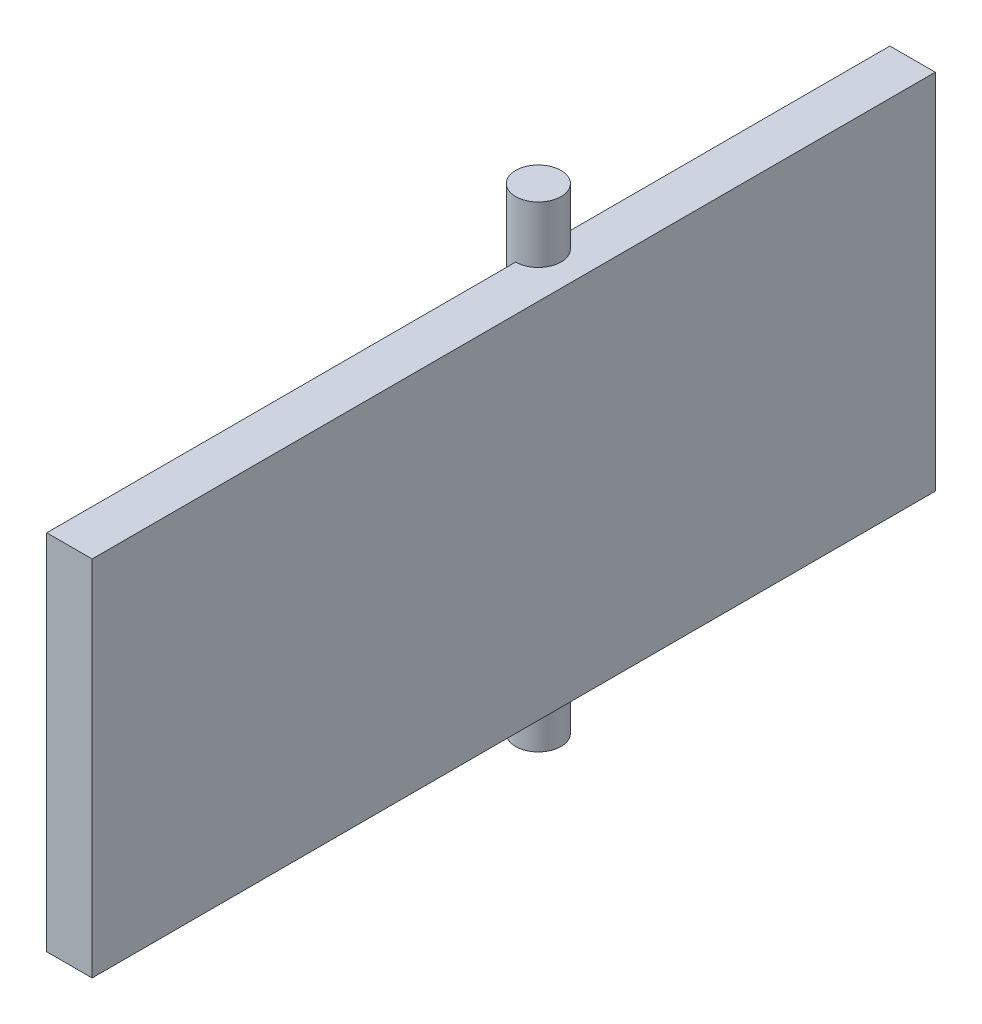
ISO-10303-21;
HEADER;
FILE_DESCRIPTION(('STEP AP214'),'2;1');
FILE_NAME('part.step','',(''),(''),'','','');
FILE_SCHEMA(('AUTOMOTIVE_DESIGN { 1 0 10303 214 1 1 1 1 }'));
ENDSEC;
DATA;
#1=APPLICATION_CONTEXT('core data for automotive mechanical design processes');
#2=APPLICATION_PROTOCOL_DEFINITION('international standard','automotive_design',2000,#1);
#3=PRODUCT_CONTEXT('',#1,'mechanical');
#4=PRODUCT('Part','Part','',(#3));
#5=PRODUCT_RELATED_PRODUCT_CATEGORY('part','',(#4));
#6=PRODUCT_DEFINITION_FORMATION('','',#4);
#7=PRODUCT_DEFINITION_CONTEXT('part definition',#1,'design');
#8=PRODUCT_DEFINITION('design','',#6,#7);
#9=PRODUCT_DEFINITION_SHAPE('','',#8);
#10=(LENGTH_UNIT() NAMED_UNIT(*) SI_UNIT(.MILLI.,.METRE.));
#11=(NAMED_UNIT(*) PLANE_ANGLE_UNIT() SI_UNIT($,.RADIAN.));
#12=(NAMED_UNIT(*) SI_UNIT($,.STERADIAN.) SOLID_ANGLE_UNIT());
#13=UNCERTAINTY_MEASURE_WITH_UNIT(LENGTH_MEASURE(1.E-05),#10,'distance_accuracy_value','');
#14=(GEOMETRIC_REPRESENTATION_CONTEXT(3) GLOBAL_UNCERTAINTY_ASSIGNED_CONTEXT((#13)) GLOBAL_UNIT_ASSIGNED_CONTEXT((#10,
#11,#12)) REPRESENTATION_CONTEXT('',''));
#15=CARTESIAN_POINT('',(0.,0.,0.));
#16=DIRECTION('',(0.,0.,1.));
#17=DIRECTION('',(1.,0.,0.));
#18=AXIS2_PLACEMENT_3D('',#15,#16,#17);
#19=CARTESIAN_POINT('',(14.295,0.,0.));
#20=DIRECTION('',(1.,0.,0.));
#21=DIRECTION('',(0.,0.,-1.));
#22=AXIS2_PLACEMENT_3D('',#19,#20,#21);
#23=PLANE('',#22);
#24=DIRECTION('',(0.,-1.,0.));
#25=VECTOR('',#24,1.);
#26=CARTESIAN_POINT('',(14.295,76.1919670440661,16.5));
#27=LINE('',#26,#25);
#28=CARTESIAN_POINT('',(14.295,70.1919670440661,16.5));
#29=VERTEX_POINT('',#28);
#30=CARTESIAN_POINT('',(14.295,73.6919670440661,16.5));
#31=VERTEX_POINT('',#30);
#32=EDGE_CURVE('E130',#29,#31,#27,.F.);
#33=ORIENTED_EDGE('',*,*,#32,.F.);
#34=DIRECTION('',(0.,0.,1.));
#35=VECTOR('',#34,1.);
#36=CARTESIAN_POINT('',(14.295,70.1919670440661,14.5));
#37=LINE('',#36,#35);
#38=CARTESIAN_POINT('',(14.295,70.1919670440661,14.5));
#39=VERTEX_POINT('',#38);
#40=EDGE_CURVE('E185',#29,#39,#37,.F.);
#41=ORIENTED_EDGE('',*,*,#40,.T.);
#42=DIRECTION('',(0.,-1.,0.));
#43=VECTOR('',#42,1.);
#44=CARTESIAN_POINT('',(14.295,76.1919670440661,14.5));
#45=LINE('',#44,#43);
#46=CARTESIAN_POINT('',(14.295,73.6919670440661,14.5));
#47=VERTEX_POINT('',#46);
#48=EDGE_CURVE('E177',#47,#39,#45,.T.);
#49=ORIENTED_EDGE('',*,*,#48,.F.);
#50=DIRECTION('',(0.,0.,1.));
#51=VECTOR('',#50,1.);
#52=CARTESIAN_POINT('',(14.295,73.6919670440661,37.175));
#53=LINE('',#52,#51);
#54=CARTESIAN_POINT('',(14.295,73.6919670440661,0.));
#55=VERTEX_POINT('',#54);
#56=EDGE_CURVE('E157',#55,#47,#53,.T.);
#57=ORIENTED_EDGE('',*,*,#56,.F.);
#58=DIRECTION('',(0.,1.,0.));
#59=VECTOR('',#58,1.);
#60=CARTESIAN_POINT('',(14.295,73.6919670440661,0.));
#61=LINE('',#60,#59);
#62=CARTESIAN_POINT('',(14.295,57.6919670440661,0.));
#63=VERTEX_POINT('',#62);
#64=EDGE_CURVE('E146',#63,#55,#61,.T.);
#65=ORIENTED_EDGE('',*,*,#64,.F.);
#66=DIRECTION('',(0.,0.,-1.));
#67=VECTOR('',#66,1.);
#68=CARTESIAN_POINT('',(14.295,57.6919670440661,37.175));
#69=LINE('',#68,#67);
#70=CARTESIAN_POINT('',(14.295,57.6919670440661,14.5));
#71=VERTEX_POINT('',#70);
#72=EDGE_CURVE('E147',#71,#63,#69,.T.);
#73=ORIENTED_EDGE('',*,*,#72,.F.);
#74=DIRECTION('',(0.,1.,0.));
#75=VECTOR('',#74,1.);
#76=CARTESIAN_POINT('',(14.295,55.1919670440661,14.5));
#77=LINE('',#76,#75);
#78=CARTESIAN_POINT('',(14.295,61.1919670440661,14.5));
#79=VERTEX_POINT('',#78);
#80=EDGE_CURVE('E124',#71,#79,#77,.T.);
#81=ORIENTED_EDGE('',*,*,#80,.T.);
#82=DIRECTION('',(0.,0.,-1.));
#83=VECTOR('',#82,1.);
#84=CARTESIAN_POINT('',(14.295,61.1919670440661,16.5));
#85=LINE('',#84,#83);
#86=CARTESIAN_POINT('',(14.295,61.1919670440661,16.5));
#87=VERTEX_POINT('',#86);
#88=EDGE_CURVE('E129',#79,#87,#85,.F.);
#89=ORIENTED_EDGE('',*,*,#88,.T.);
#90=DIRECTION('',(0.,1.,0.));
#91=VECTOR('',#90,1.);
#92=CARTESIAN_POINT('',(14.295,55.1919670440661,16.5));
#93=LINE('',#92,#91);
#94=CARTESIAN_POINT('',(14.295,57.6919670440661,16.5));
#95=VERTEX_POINT('',#94);
#96=EDGE_CURVE('E123',#87,#95,#93,.F.);
#97=ORIENTED_EDGE('',*,*,#96,.T.);
#98=CARTESIAN_POINT('',(14.295,57.6919670440661,37.175));
#99=VERTEX_POINT('',#98);
#100=EDGE_CURVE('E135',#99,#95,#69,.T.);
#101=ORIENTED_EDGE('',*,*,#100,.F.);
#102=DIRECTION('',(0.,-1.,0.));
#103=VECTOR('',#102,1.);
#104=CARTESIAN_POINT('',(14.295,73.6919670440661,37.175));
#105=LINE('',#104,#103);
#106=CARTESIAN_POINT('',(14.295,73.6919670440661,37.175));
#107=VERTEX_POINT('',#106);
#108=EDGE_CURVE('E153',#107,#99,#105,.T.);
#109=ORIENTED_EDGE('',*,*,#108,.F.);
#110=EDGE_CURVE('E151',#31,#107,#53,.T.);
#111=ORIENTED_EDGE('',*,*,#110,.F.);
#112=EDGE_LOOP('',(#33,#41,#49,#57,#65,#73,#81,#89,#97,#101,#109,#111));
#113=FACE_BOUND('',#112,.T.);
#114=ADVANCED_FACE('F44',(#113),#23,.F.);
#115=CARTESIAN_POINT('',(16.295,73.6919670440661,37.175));
#116=DIRECTION('',(0.,0.,-1.));
#117=DIRECTION('',(-1.,0.,0.));
#118=AXIS2_PLACEMENT_3D('',#115,#116,#117);
#119=PLANE('',#118);
#120=ORIENTED_EDGE('',*,*,#108,.T.);
#121=DIRECTION('',(-1.,0.,0.));
#122=VECTOR('',#121,1.);
#123=CARTESIAN_POINT('',(16.295,57.6919670440661,37.175));
#124=LINE('',#123,#122);
#125=CARTESIAN_POINT('',(16.295,57.6919670440661,37.175));
#126=VERTEX_POINT('',#125);
#127=EDGE_CURVE('E143',#126,#99,#124,.T.);
#128=ORIENTED_EDGE('',*,*,#127,.F.);
#129=DIRECTION('',(0.,-1.,0.));
#130=VECTOR('',#129,1.);
#131=CARTESIAN_POINT('',(16.295,73.6919670440661,37.175));
#132=LINE('',#131,#130);
#133=CARTESIAN_POINT('',(16.295,73.6919670440661,37.175));
#134=VERTEX_POINT('',#133);
#135=EDGE_CURVE('E161',#134,#126,#132,.T.);
#136=ORIENTED_EDGE('',*,*,#135,.F.);
#137=DIRECTION('',(-1.,0.,0.));
#138=VECTOR('',#137,1.);
#139=CARTESIAN_POINT('',(16.295,73.6919670440661,37.175));
#140=LINE('',#139,#138);
#141=EDGE_CURVE('E162',#134,#107,#140,.T.);
#142=ORIENTED_EDGE('',*,*,#141,.T.);
#143=EDGE_LOOP('',(#120,#128,#136,#142));
#144=FACE_BOUND('',#143,.T.);
#145=ADVANCED_FACE('F211',(#144),#119,.F.);
#146=CARTESIAN_POINT('',(16.295,57.6919670440661,37.175));
#147=DIRECTION('',(0.,1.,0.));
#148=DIRECTION('',(0.,0.,1.));
#149=AXIS2_PLACEMENT_3D('',#146,#147,#148);
#150=PLANE('',#149);
#151=ORIENTED_EDGE('',*,*,#100,.T.);
#152=CARTESIAN_POINT('',(14.295,57.6919670440661,15.5));
#153=DIRECTION('',(0.,1.,0.));
#154=DIRECTION('',(0.,0.,1.));
#155=AXIS2_PLACEMENT_3D('',#152,#153,#154);
#156=CIRCLE('',#155,1.);
#157=EDGE_CURVE('E120',#95,#71,#156,.T.);
#158=ORIENTED_EDGE('',*,*,#157,.T.);
#159=ORIENTED_EDGE('',*,*,#72,.T.);
#160=DIRECTION('',(-1.,0.,0.));
#161=VECTOR('',#160,1.);
#162=CARTESIAN_POINT('',(16.295,57.6919670440661,0.));
#163=LINE('',#162,#161);
#164=CARTESIAN_POINT('',(16.295,57.6919670440661,0.));
#165=VERTEX_POINT('',#164);
#166=EDGE_CURVE('E171',#165,#63,#163,.T.);
#167=ORIENTED_EDGE('',*,*,#166,.F.);
#168=DIRECTION('',(0.,0.,-1.));
#169=VECTOR('',#168,1.);
#170=CARTESIAN_POINT('',(16.295,57.6919670440661,37.175));
#171=LINE('',#170,#169);
#172=EDGE_CURVE('E238',#126,#165,#171,.T.);
#173=ORIENTED_EDGE('',*,*,#172,.F.);
#174=ORIENTED_EDGE('',*,*,#127,.T.);
#175=EDGE_LOOP('',(#151,#158,#159,#167,#173,#174));
#176=FACE_BOUND('',#175,.T.);
#177=ADVANCED_FACE('F141',(#176),#150,.F.);
#178=CARTESIAN_POINT('',(16.295,73.6919670440661,0.));
#179=DIRECTION('',(0.,0.,1.));
#180=DIRECTION('',(1.,0.,0.));
#181=AXIS2_PLACEMENT_3D('',#178,#179,#180);
#182=PLANE('',#181);
#183=ORIENTED_EDGE('',*,*,#64,.T.);
#184=DIRECTION('',(-1.,0.,0.));
#185=VECTOR('',#184,1.);
#186=CARTESIAN_POINT('',(16.295,73.6919670440661,0.));
#187=LINE('',#186,#185);
#188=CARTESIAN_POINT('',(16.295,73.6919670440661,0.));
#189=VERTEX_POINT('',#188);
#190=EDGE_CURVE('E166',#189,#55,#187,.T.);
#191=ORIENTED_EDGE('',*,*,#190,.F.);
#192=DIRECTION('',(0.,1.,0.));
#193=VECTOR('',#192,1.);
#194=CARTESIAN_POINT('',(16.295,73.6919670440661,0.));
#195=LINE('',#194,#193);
#196=EDGE_CURVE('E258',#165,#189,#195,.T.);
#197=ORIENTED_EDGE('',*,*,#196,.F.);
#198=ORIENTED_EDGE('',*,*,#166,.T.);
#199=EDGE_LOOP('',(#183,#191,#197,#198));
#200=FACE_BOUND('',#199,.T.);
#201=ADVANCED_FACE('F218',(#200),#182,.F.);
#202=CARTESIAN_POINT('',(16.295,73.6919670440661,37.175));
#203=DIRECTION('',(0.,-1.,0.));
#204=DIRECTION('',(0.,0.,-1.));
#205=AXIS2_PLACEMENT_3D('',#202,#203,#204);
#206=PLANE('',#205);
#207=CARTESIAN_POINT('',(14.295,73.6919670440661,15.5));
#208=DIRECTION('',(0.,-1.,0.));
#209=DIRECTION('',(0.,0.,-1.));
#210=AXIS2_PLACEMENT_3D('',#207,#208,#209);
#211=CIRCLE('',#210,1.);
#212=EDGE_CURVE('E246',#31,#47,#211,.F.);
#213=ORIENTED_EDGE('',*,*,#212,.F.);
#214=ORIENTED_EDGE('',*,*,#110,.T.);
#215=ORIENTED_EDGE('',*,*,#141,.F.);
#216=DIRECTION('',(0.,0.,1.));
#217=VECTOR('',#216,1.);
#218=CARTESIAN_POINT('',(16.295,73.6919670440661,37.175));
#219=LINE('',#218,#217);
#220=EDGE_CURVE('E167',#189,#134,#219,.T.);
#221=ORIENTED_EDGE('',*,*,#220,.F.);
#222=ORIENTED_EDGE('',*,*,#190,.T.);
#223=ORIENTED_EDGE('',*,*,#56,.T.);
#224=EDGE_LOOP('',(#213,#214,#215,#221,#222,#223));
#225=FACE_BOUND('',#224,.T.);
#226=ADVANCED_FACE('F221',(#225),#206,.F.);
#227=CARTESIAN_POINT('',(16.295,0.,0.));
#228=DIRECTION('',(1.,0.,0.));
#229=DIRECTION('',(0.,0.,-1.));
#230=AXIS2_PLACEMENT_3D('',#227,#228,#229);
#231=PLANE('',#230);
#232=ORIENTED_EDGE('',*,*,#135,.T.);
#233=ORIENTED_EDGE('',*,*,#172,.T.);
#234=ORIENTED_EDGE('',*,*,#196,.T.);
#235=ORIENTED_EDGE('',*,*,#220,.T.);
#236=EDGE_LOOP('',(#232,#233,#234,#235));
#237=FACE_BOUND('',#236,.T.);
#238=ADVANCED_FACE('F225',(#237),#231,.T.);
#239=CARTESIAN_POINT('',(14.295,76.1919670440661,15.5));
#240=DIRECTION('',(0.,-1.,0.));
#241=DIRECTION('',(0.,0.,-1.));
#242=AXIS2_PLACEMENT_3D('',#239,#240,#241);
#243=CYLINDRICAL_SURFACE('',#242,1.);
#244=CARTESIAN_POINT('',(14.295,76.1919670440661,15.5));
#245=DIRECTION('',(0.,1.,0.));
#246=DIRECTION('',(0.,0.,1.));
#247=AXIS2_PLACEMENT_3D('',#244,#245,#246);
#248=CIRCLE('',#247,1.);
#249=CARTESIAN_POINT('',(14.295,76.1919670440661,16.5));
#250=VERTEX_POINT('',#249);
#251=EDGE_CURVE('E249',#250,#250,#248,.T.);
#252=ORIENTED_EDGE('',*,*,#251,.F.);
#253=EDGE_LOOP('',(#252));
#254=FACE_BOUND('',#253,.T.);
#255=ORIENTED_EDGE('',*,*,#48,.T.);
#256=CARTESIAN_POINT('',(14.295,70.1919670440661,14.5));
#257=CARTESIAN_POINT('',(14.2950025550744,70.2198052367879,14.5000084726861));
#258=CARTESIAN_POINT('',(14.2938375494361,70.2476421271243,14.50000021537));
#259=CARTESIAN_POINT('',(14.289192246194,70.3031219155914,14.5000119302077));
#260=CARTESIAN_POINT('',(14.285711962686,70.3307648149021,14.5000319021896));
#261=CARTESIAN_POINT('',(14.2764477931608,70.3857138560473,14.500161877896));
#262=CARTESIAN_POINT('',(14.2706598664325,70.4130193201017,14.5002720399026));
#263=CARTESIAN_POINT('',(14.2568275144874,70.4670424217103,14.5007051556566));
#264=CARTESIAN_POINT('',(14.2487831184668,70.4937600668655,14.5010281066508));
#265=CARTESIAN_POINT('',(14.2213194545419,70.5728056447075,14.5025463105821));
#266=CARTESIAN_POINT('',(14.1985713868733,70.6240163288335,14.5042909948775));
#267=CARTESIAN_POINT('',(14.1449735909556,70.7217285583307,14.5109521102541));
#268=CARTESIAN_POINT('',(14.1141312905753,70.7682343673108,14.5158656393623));
#269=CARTESIAN_POINT('',(14.0469576585634,70.8533121438701,14.5306663007788));
#270=CARTESIAN_POINT('',(14.0108875781512,70.8921229419679,14.5403518073493));
#271=CARTESIAN_POINT('',(13.9344302429271,70.9625638896558,14.5664010018036));
#272=CARTESIAN_POINT('',(13.8940497043936,70.9942049771538,14.582754409152));
#273=CARTESIAN_POINT('',(13.8174063482864,71.0457421899686,14.6205265775903));
#274=CARTESIAN_POINT('',(13.7813313353144,71.0666508236321,14.6409526814356));
#275=CARTESIAN_POINT('',(13.7101311104752,71.1026026921886,14.6877558294031));
#276=CARTESIAN_POINT('',(13.675005939995,71.1176456718827,14.7141331323671));
#277=CARTESIAN_POINT('',(13.6095565808777,71.1418114472942,14.7706641697465));
#278=CARTESIAN_POINT('',(13.5790721788668,71.1512265373317,14.8005109096799));
#279=CARTESIAN_POINT('',(13.521804963194,71.1663581262036,14.8643811864625));
#280=CARTESIAN_POINT('',(13.4950230418303,71.1720737346804,14.8984057264442));
#281=CARTESIAN_POINT('',(13.4435493809667,71.1812520801868,14.9734075698069));
#282=CARTESIAN_POINT('',(13.4193261184073,71.1844361950173,15.0147396942126));
#283=CARTESIAN_POINT('',(13.3770001291804,71.1888267951308,15.1005374802067));
#284=CARTESIAN_POINT('',(13.3589025130841,71.1900316323334,15.145005721042));
#285=CARTESIAN_POINT('',(13.3278546201789,71.1915612722235,15.2404323667974));
#286=CARTESIAN_POINT('',(13.3155537282614,71.1917919782696,15.2916066781811));
#287=CARTESIAN_POINT('',(13.3032331050194,71.1919403658679,15.3692769087492));
#288=CARTESIAN_POINT('',(13.3001480132923,71.1919568686932,15.3953230973099));
#289=CARTESIAN_POINT('',(13.2960317386661,71.1919676724356,15.4475756022013));
#290=CARTESIAN_POINT('',(13.2950004216528,71.1919619748024,15.4737819079639));
#291=CARTESIAN_POINT('',(13.295,71.1919670440661,15.5));
#292=B_SPLINE_CURVE_WITH_KNOTS('',3,(#256,#257,#258,#259,#260,#261,#262,#263,#264,#265,#266,
#267,#268,#269,#270,#271,#272,#273,#274,#275,#276,#277,#278,#279,#280,#281,#282,#283,#284,#285,
#286,#287,#288,#289,#290,#291),.UNSPECIFIED.,.F.,.F.,(4,2,2,2,2,2,2,2,2,2,2,2,2,2,2,2,2,4),(0.,
0.0834878347281844,0.166975161167899,0.250609321497245,0.334242399739234,0.501538275082861,
0.66868116090358,0.829299803909295,0.989671736729554,1.12821123604275,1.26675676216527,
1.39728229603102,1.52783923192527,1.671304684928,1.81488953652531,1.97206569111011,
2.05068136863726,2.12929191228916),.UNSPECIFIED.);
#293=CARTESIAN_POINT('',(13.295,71.1919670440661,15.5));
#294=VERTEX_POINT('',#293);
#295=EDGE_CURVE('E72',#39,#294,#292,.T.);
#296=ORIENTED_EDGE('',*,*,#295,.T.);
#297=CARTESIAN_POINT('',(13.295,71.1919670440661,15.5));
#298=CARTESIAN_POINT('',(13.2949974449256,71.19195857138,15.5278381927218));
#299=CARTESIAN_POINT('',(13.2961624505639,71.1919668286961,15.5556750830582));
#300=CARTESIAN_POINT('',(13.300807753806,71.1919551138584,15.6111548715253));
#301=CARTESIAN_POINT('',(13.3042880373139,71.1919351418765,15.638797770836));
#302=CARTESIAN_POINT('',(13.3135522068392,71.1918051661701,15.6937468119812));
#303=CARTESIAN_POINT('',(13.3193401335675,71.1916950041636,15.7210522760356));
#304=CARTESIAN_POINT('',(13.3331724855126,71.1912618884095,15.7750753776442));
#305=CARTESIAN_POINT('',(13.3412168815333,71.1909389374153,15.8017930227994));
#306=CARTESIAN_POINT('',(13.3686805454581,71.189420733484,15.8808386006414));
#307=CARTESIAN_POINT('',(13.3914286131267,71.1876760491886,15.9320492847674));
#308=CARTESIAN_POINT('',(13.4450264090444,71.181014933812,16.0297615142646));
#309=CARTESIAN_POINT('',(13.4758687094248,71.1761014047039,16.0762673232447));
#310=CARTESIAN_POINT('',(13.5430423414366,71.1613007432873,16.161345099804));
#311=CARTESIAN_POINT('',(13.5791124218488,71.1516152367168,16.2001558979018));
#312=CARTESIAN_POINT('',(13.6555697570729,71.1255660422625,16.2705968455897));
#313=CARTESIAN_POINT('',(13.6959502956064,71.1092126349141,16.3022379330876));
#314=CARTESIAN_POINT('',(13.7725936517136,71.0714404664758,16.3537751459025));
#315=CARTESIAN_POINT('',(13.8086686646856,71.0510143626305,16.374683779566));
#316=CARTESIAN_POINT('',(13.8798688895248,71.004211214663,16.4106356481225));
#317=CARTESIAN_POINT('',(13.914994060005,70.977833911699,16.4256786278166));
#318=CARTESIAN_POINT('',(13.9804434191223,70.9213028743196,16.449844403228));
#319=CARTESIAN_POINT('',(14.0109278211332,70.8914561343862,16.4592594932656));
#320=CARTESIAN_POINT('',(14.068195036806,70.8275858576036,16.4743910821375));
#321=CARTESIAN_POINT('',(14.0949769581697,70.7935613176219,16.4801066906143));
#322=CARTESIAN_POINT('',(14.1464506190333,70.7185594742592,16.4892850361206));
#323=CARTESIAN_POINT('',(14.1706738815927,70.6772273498535,16.4924691509512));
#324=CARTESIAN_POINT('',(14.2129998708196,70.5914295638594,16.4968597510647));
#325=CARTESIAN_POINT('',(14.2310974869159,70.5469613230241,16.4980645882673));
#326=CARTESIAN_POINT('',(14.2621453798211,70.4515346772687,16.4995942281574));
#327=CARTESIAN_POINT('',(14.2744462717386,70.400360365885,16.4998249342035));
#328=CARTESIAN_POINT('',(14.2867668949806,70.3226901353169,16.4999733218018));
#329=CARTESIAN_POINT('',(14.2898519867077,70.2966439467562,16.4999898246271));
#330=CARTESIAN_POINT('',(14.2939682613339,70.2443914418648,16.5000006283695));
#331=CARTESIAN_POINT('',(14.2949995783472,70.2181851361022,16.4999949307363));
#332=CARTESIAN_POINT('',(14.295,70.1919670440661,16.5));
#333=B_SPLINE_CURVE_WITH_KNOTS('',3,(#297,#298,#299,#300,#301,#302,#303,#304,#305,#306,#307,
#308,#309,#310,#311,#312,#313,#314,#315,#316,#317,#318,#319,#320,#321,#322,#323,#324,#325,#326,
#327,#328,#329,#330,#331,#332),.UNSPECIFIED.,.F.,.F.,(4,2,2,2,2,2,2,2,2,2,2,2,2,2,2,2,2,4),(0.,
0.0834878347281738,0.166975161167904,0.250609321497257,0.334242399739243,0.501538275082884,
0.668681160903598,0.829299803909305,0.989671736729571,1.12821123604276,1.26675676216528,
1.39728229603104,1.52783923192529,1.67130468492802,1.81488953652533,1.97206569111013,
2.05068136863728,2.12929191228916),.UNSPECIFIED.);
#334=EDGE_CURVE('E189',#294,#29,#333,.T.);
#335=ORIENTED_EDGE('',*,*,#334,.T.);
#336=ORIENTED_EDGE('',*,*,#32,.T.);
#337=ORIENTED_EDGE('',*,*,#212,.T.);
#338=EDGE_LOOP('',(#255,#296,#335,#336,#337));
#339=FACE_BOUND('',#338,.T.);
#340=ADVANCED_FACE('F201',(#254,#339),#243,.T.);
#341=CARTESIAN_POINT('',(14.295,76.1919670440661,15.5));
#342=DIRECTION('',(0.,1.,0.));
#343=DIRECTION('',(0.,0.,1.));
#344=AXIS2_PLACEMENT_3D('',#341,#342,#343);
#345=PLANE('',#344);
#346=ORIENTED_EDGE('',*,*,#251,.T.);
#347=EDGE_LOOP('',(#346));
#348=FACE_BOUND('',#347,.T.);
#349=ADVANCED_FACE('F234',(#348),#345,.T.);
#350=CARTESIAN_POINT('',(14.295,55.1919670440661,15.5));
#351=DIRECTION('',(0.,1.,0.));
#352=DIRECTION('',(0.,0.,1.));
#353=AXIS2_PLACEMENT_3D('',#350,#351,#352);
#354=CYLINDRICAL_SURFACE('',#353,1.);
#355=CARTESIAN_POINT('',(14.295,55.1919670440661,15.5));
#356=DIRECTION('',(0.,1.,0.));
#357=DIRECTION('',(0.,0.,1.));
#358=AXIS2_PLACEMENT_3D('',#355,#356,#357);
#359=CIRCLE('',#358,1.);
#360=CARTESIAN_POINT('',(14.295,55.1919670440661,16.5));
#361=VERTEX_POINT('',#360);
#362=EDGE_CURVE('E139',#361,#361,#359,.T.);
#363=ORIENTED_EDGE('',*,*,#362,.T.);
#364=EDGE_LOOP('',(#363));
#365=FACE_BOUND('',#364,.T.);
#366=ORIENTED_EDGE('',*,*,#80,.F.);
#367=ORIENTED_EDGE('',*,*,#157,.F.);
#368=ORIENTED_EDGE('',*,*,#96,.F.);
#369=CARTESIAN_POINT('',(14.295,61.1919670440661,16.5));
#370=CARTESIAN_POINT('',(14.2950025550744,61.1641288513443,16.4999915273139));
#371=CARTESIAN_POINT('',(14.2938375494361,61.1362919610079,16.49999978463));
#372=CARTESIAN_POINT('',(14.289192246194,61.0808121725408,16.4999880697923));
#373=CARTESIAN_POINT('',(14.2857119626861,61.0531692732301,16.4999680978104));
#374=CARTESIAN_POINT('',(14.2764477931608,60.9982202320849,16.499838122104));
#375=CARTESIAN_POINT('',(14.2706598664325,60.9709147680306,16.4997279600974));
#376=CARTESIAN_POINT('',(14.2568275144874,60.9168916664219,16.4992948443434));
#377=CARTESIAN_POINT('',(14.2487831184668,60.8901740212667,16.4989718933492));
#378=CARTESIAN_POINT('',(14.2213194545419,60.8111284434247,16.4974536894179));
#379=CARTESIAN_POINT('',(14.1985713868733,60.7599177592987,16.4957090051225));
#380=CARTESIAN_POINT('',(14.1449735909556,60.6622055298015,16.4890478897459));
#381=CARTESIAN_POINT('',(14.1141312905752,60.6156997208215,16.4841343606377));
#382=CARTESIAN_POINT('',(14.0469576585634,60.5306219442621,16.4693336992212));
#383=CARTESIAN_POINT('',(14.0108875781512,60.4918111461644,16.4596481926507));
#384=CARTESIAN_POINT('',(13.9344302429271,60.4213701984764,16.4335989981964));
#385=CARTESIAN_POINT('',(13.8940497043936,60.3897291109785,16.417245590848));
#386=CARTESIAN_POINT('',(13.8174063482864,60.3381918981637,16.3794734224097));
#387=CARTESIAN_POINT('',(13.7813313353144,60.3172832645001,16.3590473185644));
#388=CARTESIAN_POINT('',(13.7101311104752,60.2813313959436,16.3122441705969));
#389=CARTESIAN_POINT('',(13.675005939995,60.2662884162495,16.2858668676329));
#390=CARTESIAN_POINT('',(13.6095565808777,60.2421226408381,16.2293358302535));
#391=CARTESIAN_POINT('',(13.5790721788668,60.2327075508005,16.1994890903201));
#392=CARTESIAN_POINT('',(13.521804963194,60.2175759619286,16.1356188135375));
#393=CARTESIAN_POINT('',(13.4950230418303,60.2118603534518,16.1015942735558));
#394=CARTESIAN_POINT('',(13.4435493809667,60.2026820079455,16.0265924301931));
#395=CARTESIAN_POINT('',(13.4193261184073,60.199497893115,15.9852603057874));
#396=CARTESIAN_POINT('',(13.3770001291804,60.1951072930015,15.8994625197933));
#397=CARTESIAN_POINT('',(13.3589025130841,60.1939024557988,15.854994278958));
#398=CARTESIAN_POINT('',(13.3278546201789,60.1923728159088,15.7595676332026));
#399=CARTESIAN_POINT('',(13.3155537282614,60.1921421098627,15.7083933218189));
#400=CARTESIAN_POINT('',(13.3032331050194,60.1919937222643,15.6307230912508));
#401=CARTESIAN_POINT('',(13.3001480132923,60.191977219439,15.6046769026901));
#402=CARTESIAN_POINT('',(13.2960317386661,60.1919664156966,15.5524243977987));
#403=CARTESIAN_POINT('',(13.2950004216528,60.1919721133298,15.5262180920361));
#404=CARTESIAN_POINT('',(13.295,60.1919670440661,15.5));
#405=B_SPLINE_CURVE_WITH_KNOTS('',3,(#369,#370,#371,#372,#373,#374,#375,#376,#377,#378,#379,
#380,#381,#382,#383,#384,#385,#386,#387,#388,#389,#390,#391,#392,#393,#394,#395,#396,#397,#398,
#399,#400,#401,#402,#403,#404),.UNSPECIFIED.,.F.,.F.,(4,2,2,2,2,2,2,2,2,2,2,2,2,2,2,2,2,4),(0.,
0.0834878347281635,0.166975161167892,0.250609321497245,0.334242399739241,0.501538275082891,
0.668681160903595,0.82929980390931,0.989671736729569,1.12821123604275,1.26675676216527,
1.39728229603103,1.52783923192528,1.671304684928,1.81488953652532,1.97206569111012,
2.05068136863727,2.12929191228916),.UNSPECIFIED.);
#406=CARTESIAN_POINT('',(13.295,60.1919670440661,15.5));
#407=VERTEX_POINT('',#406);
#408=EDGE_CURVE('E11',#87,#407,#405,.T.);
#409=ORIENTED_EDGE('',*,*,#408,.T.);
#410=CARTESIAN_POINT('',(13.295,60.1919670440661,15.5));
#411=CARTESIAN_POINT('',(13.2949974449256,60.1919755167523,15.4721618072782));
#412=CARTESIAN_POINT('',(13.2961624505639,60.1919672594362,15.4443249169418));
#413=CARTESIAN_POINT('',(13.300807753806,60.1919789742739,15.3888451284747));
#414=CARTESIAN_POINT('',(13.3042880373139,60.1919989462558,15.361202229164));
#415=CARTESIAN_POINT('',(13.3135522068392,60.1921289219621,15.3062531880188));
#416=CARTESIAN_POINT('',(13.3193401335675,60.1922390839687,15.2789477239644));
#417=CARTESIAN_POINT('',(13.3331724855126,60.1926721997227,15.2249246223558));
#418=CARTESIAN_POINT('',(13.3412168815332,60.192995150717,15.1982069772006));
#419=CARTESIAN_POINT('',(13.3686805454581,60.1945133546482,15.1191613993586));
#420=CARTESIAN_POINT('',(13.3914286131267,60.1962580389436,15.0679507152326));
#421=CARTESIAN_POINT('',(13.4450264090444,60.2029191543202,14.9702384857354));
#422=CARTESIAN_POINT('',(13.4758687094248,60.2078326834284,14.9237326767553));
#423=CARTESIAN_POINT('',(13.5430423414366,60.222633344845,14.838654900196));
#424=CARTESIAN_POINT('',(13.5791124218488,60.2323188514155,14.7998441020982));
#425=CARTESIAN_POINT('',(13.6555697570729,60.2583680458697,14.7294031544103));
#426=CARTESIAN_POINT('',(13.6959502956064,60.2747214532182,14.6977620669124));
#427=CARTESIAN_POINT('',(13.7725936517136,60.3124936216564,14.6462248540975));
#428=CARTESIAN_POINT('',(13.8086686646856,60.3329197255017,14.625316220434));
#429=CARTESIAN_POINT('',(13.8798688895248,60.3797228734692,14.5893643518775));
#430=CARTESIAN_POINT('',(13.914994060005,60.4061001764333,14.5743213721834));
#431=CARTESIAN_POINT('',(13.9804434191223,60.4626312138126,14.550155596772));
#432=CARTESIAN_POINT('',(14.0109278211332,60.492477953746,14.5407405067344));
#433=CARTESIAN_POINT('',(14.068195036806,60.5563482305286,14.5256089178625));
#434=CARTESIAN_POINT('',(14.0949769581697,60.5903727705104,14.5198933093857));
#435=CARTESIAN_POINT('',(14.1464506190333,60.665374613873,14.5107149638794));
#436=CARTESIAN_POINT('',(14.1706738815927,60.7067067382787,14.5075308490489));
#437=CARTESIAN_POINT('',(14.2129998708196,60.7925045242729,14.5031402489353));
#438=CARTESIAN_POINT('',(14.2310974869159,60.8369727651081,14.5019354117327));
#439=CARTESIAN_POINT('',(14.2621453798211,60.9323994108636,14.5004057718426));
#440=CARTESIAN_POINT('',(14.2744462717386,60.9835737222473,14.5001750657965));
#441=CARTESIAN_POINT('',(14.2867668949806,61.0612439528153,14.5000266781982));
#442=CARTESIAN_POINT('',(14.2898519867077,61.0872901413761,14.5000101753729));
#443=CARTESIAN_POINT('',(14.2939682613339,61.1395426462674,14.4999993716305));
#444=CARTESIAN_POINT('',(14.2949995783472,61.1657489520301,14.5000050692637));
#445=CARTESIAN_POINT('',(14.295,61.1919670440661,14.5));
#446=B_SPLINE_CURVE_WITH_KNOTS('',3,(#410,#411,#412,#413,#414,#415,#416,#417,#418,#419,#420,
#421,#422,#423,#424,#425,#426,#427,#428,#429,#430,#431,#432,#433,#434,#435,#436,#437,#438,#439,
#440,#441,#442,#443,#444,#445),.UNSPECIFIED.,.F.,.F.,(4,2,2,2,2,2,2,2,2,2,2,2,2,2,2,2,2,4),(0.,
0.0834878347281738,0.166975161167902,0.250609321497254,0.334242399739241,0.501538275082881,
0.668681160903593,0.829299803909307,0.989671736729569,1.12821123604276,1.26675676216528,
1.39728229603103,1.52783923192528,1.671304684928,1.81488953652532,1.97206569111011,
2.05068136863726,2.12929191228916),.UNSPECIFIED.);
#447=EDGE_CURVE('E59',#407,#79,#446,.T.);
#448=ORIENTED_EDGE('',*,*,#447,.T.);
#449=EDGE_LOOP('',(#366,#367,#368,#409,#448));
#450=FACE_BOUND('',#449,.T.);
#451=ADVANCED_FACE('F122',(#365,#450),#354,.T.);
#452=CARTESIAN_POINT('',(14.295,55.1919670440661,15.5));
#453=DIRECTION('',(0.,-1.,0.));
#454=DIRECTION('',(0.,0.,1.));
#455=AXIS2_PLACEMENT_3D('',#452,#453,#454);
#456=PLANE('',#455);
#457=ORIENTED_EDGE('',*,*,#362,.F.);
#458=EDGE_LOOP('',(#457));
#459=FACE_BOUND('',#458,.T.);
#460=ADVANCED_FACE('F209',(#459),#456,.T.);
#461=CARTESIAN_POINT('',(13.295,70.1919670440661,15.5));
#462=DIRECTION('',(0.,0.,-1.));
#463=DIRECTION('',(-1.,0.,0.));
#464=AXIS2_PLACEMENT_3D('',#461,#462,#463);
#465=CYLINDRICAL_SURFACE('',#464,1.);
#466=ORIENTED_EDGE('',*,*,#295,.F.);
#467=ORIENTED_EDGE('',*,*,#40,.F.);
#468=ORIENTED_EDGE('',*,*,#334,.F.);
#469=EDGE_LOOP('',(#466,#467,#468));
#470=FACE_BOUND('',#469,.T.);
#471=ADVANCED_FACE('F205',(#470),#465,.F.);
#472=CARTESIAN_POINT('',(13.295,61.1919670440661,15.5));
#473=DIRECTION('',(0.,0.,1.));
#474=DIRECTION('',(1.,0.,0.));
#475=AXIS2_PLACEMENT_3D('',#472,#473,#474);
#476=CYLINDRICAL_SURFACE('',#475,1.);
#477=ORIENTED_EDGE('',*,*,#408,.F.);
#478=ORIENTED_EDGE('',*,*,#88,.F.);
#479=ORIENTED_EDGE('',*,*,#447,.F.);
#480=EDGE_LOOP('',(#477,#478,#479));
#481=FACE_BOUND('',#480,.T.);
#482=ADVANCED_FACE('F46',(#481),#476,.F.);
#483=CLOSED_SHELL('',(#114,#145,#177,#201,#226,#238,#340,#349,#451,#460,#471,#482));
#484=MANIFOLD_SOLID_BREP('B2',#483);
#485=ADVANCED_BREP_SHAPE_REPRESENTATION('',(#18,#484),#14);
#486=SHAPE_DEFINITION_REPRESENTATION(#9,#485);
ENDSEC;
END-ISO-10303-21;
